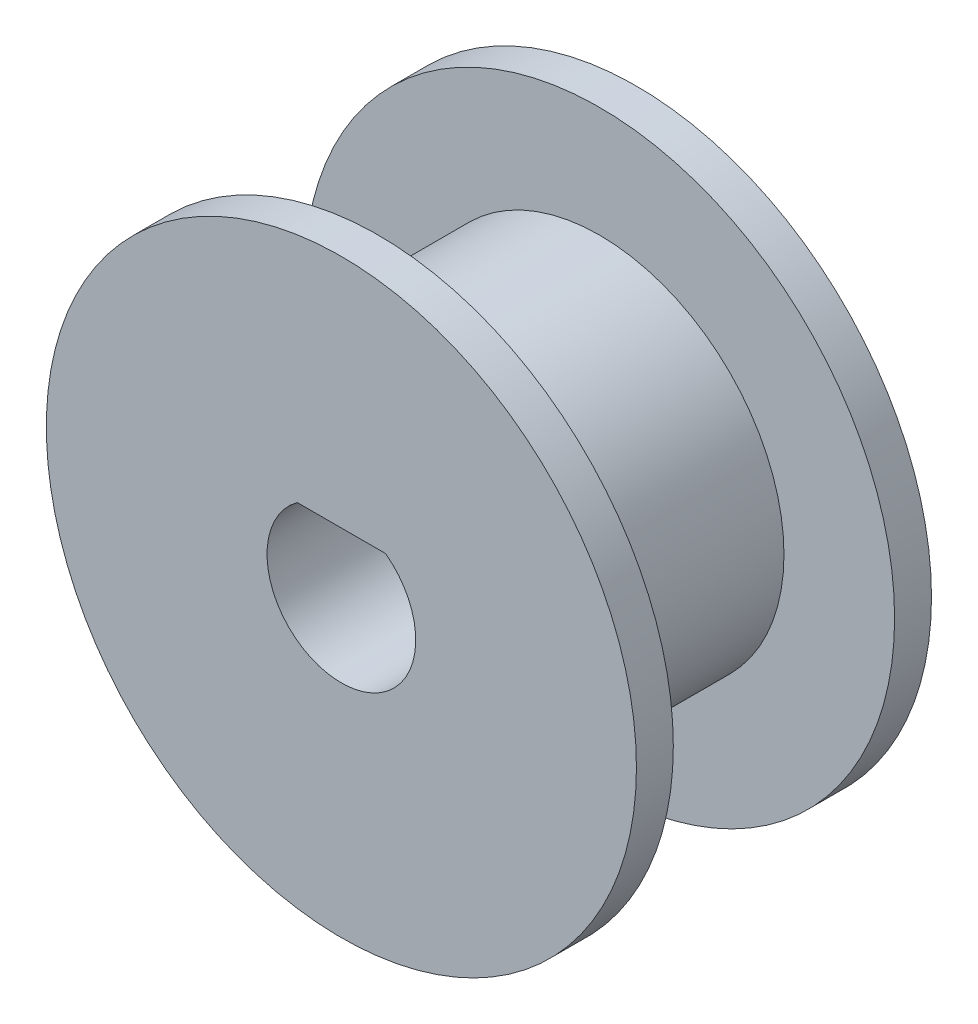
ISO-10303-21;
HEADER;
FILE_DESCRIPTION(('STEP AP214'),'2;1');
FILE_NAME('part.step','',(''),(''),'','','');
FILE_SCHEMA(('AUTOMOTIVE_DESIGN { 1 0 10303 214 1 1 1 1 }'));
ENDSEC;
DATA;
#1=APPLICATION_CONTEXT('core data for automotive mechanical design processes');
#2=APPLICATION_PROTOCOL_DEFINITION('international standard','automotive_design',2000,#1);
#3=PRODUCT_CONTEXT('',#1,'mechanical');
#4=PRODUCT('Part','Part','',(#3));
#5=PRODUCT_RELATED_PRODUCT_CATEGORY('part','',(#4));
#6=PRODUCT_DEFINITION_FORMATION('','',#4);
#7=PRODUCT_DEFINITION_CONTEXT('part definition',#1,'design');
#8=PRODUCT_DEFINITION('design','',#6,#7);
#9=PRODUCT_DEFINITION_SHAPE('','',#8);
#10=(LENGTH_UNIT() NAMED_UNIT(*) SI_UNIT(.MILLI.,.METRE.));
#11=(NAMED_UNIT(*) PLANE_ANGLE_UNIT() SI_UNIT($,.RADIAN.));
#12=(NAMED_UNIT(*) SI_UNIT($,.STERADIAN.) SOLID_ANGLE_UNIT());
#13=UNCERTAINTY_MEASURE_WITH_UNIT(LENGTH_MEASURE(1.E-05),#10,'distance_accuracy_value','');
#14=(GEOMETRIC_REPRESENTATION_CONTEXT(3) GLOBAL_UNCERTAINTY_ASSIGNED_CONTEXT((#13)) GLOBAL_UNIT_ASSIGNED_CONTEXT((#10,
#11,#12)) REPRESENTATION_CONTEXT('',''));
#15=CARTESIAN_POINT('',(0.,0.,0.));
#16=DIRECTION('',(0.,0.,1.));
#17=DIRECTION('',(1.,0.,0.));
#18=AXIS2_PLACEMENT_3D('',#15,#16,#17);
#19=CARTESIAN_POINT('',(0.,0.,6.35));
#20=DIRECTION('',(0.,0.,-1.));
#21=DIRECTION('',(-1.,0.,0.));
#22=AXIS2_PLACEMENT_3D('',#19,#20,#21);
#23=CYLINDRICAL_SURFACE('',#22,12.7);
#24=CARTESIAN_POINT('',(0.,0.,-6.35));
#25=DIRECTION('',(0.,0.,1.));
#26=DIRECTION('',(1.,0.,0.));
#27=AXIS2_PLACEMENT_3D('',#24,#25,#26);
#28=CIRCLE('',#27,12.7);
#29=CARTESIAN_POINT('',(12.7,0.,-6.35));
#30=VERTEX_POINT('',#29);
#31=EDGE_CURVE('E43',#30,#30,#28,.T.);
#32=ORIENTED_EDGE('',*,*,#31,.T.);
#33=EDGE_LOOP('',(#32));
#34=FACE_BOUND('',#33,.T.);
#35=CARTESIAN_POINT('',(0.,0.,-4.7625));
#36=DIRECTION('',(0.,0.,1.));
#37=DIRECTION('',(1.,0.,0.));
#38=AXIS2_PLACEMENT_3D('',#35,#36,#37);
#39=CIRCLE('',#38,12.7);
#40=CARTESIAN_POINT('',(12.7,0.,-4.7625));
#41=VERTEX_POINT('',#40);
#42=EDGE_CURVE('E38',#41,#41,#39,.T.);
#43=ORIENTED_EDGE('',*,*,#42,.F.);
#44=EDGE_LOOP('',(#43));
#45=FACE_BOUND('',#44,.T.);
#46=ADVANCED_FACE('F34',(#34,#45),#23,.T.);
#47=CARTESIAN_POINT('',(0.,0.,-6.35));
#48=DIRECTION('',(0.,0.,1.));
#49=DIRECTION('',(1.,0.,0.));
#50=AXIS2_PLACEMENT_3D('',#47,#48,#49);
#51=PLANE('',#50);
#52=DIRECTION('',(-1.,0.,0.));
#53=VECTOR('',#52,1.);
#54=CARTESIAN_POINT('',(-1.9,2.57487863791675,-6.35));
#55=LINE('',#54,#53);
#56=CARTESIAN_POINT('',(1.9,2.57487863791675,-6.35));
#57=VERTEX_POINT('',#56);
#58=CARTESIAN_POINT('',(-1.9,2.57487863791675,-6.35));
#59=VERTEX_POINT('',#58);
#60=EDGE_CURVE('E80',#57,#59,#55,.T.);
#61=ORIENTED_EDGE('',*,*,#60,.T.);
#62=CARTESIAN_POINT('',(0.,0.,-6.35));
#63=DIRECTION('',(0.,0.,1.));
#64=DIRECTION('',(1.,0.,0.));
#65=AXIS2_PLACEMENT_3D('',#62,#63,#64);
#66=CIRCLE('',#65,3.2);
#67=EDGE_CURVE('E51',#59,#57,#66,.T.);
#68=ORIENTED_EDGE('',*,*,#67,.T.);
#69=EDGE_LOOP('',(#61,#68));
#70=FACE_BOUND('',#69,.T.);
#71=ORIENTED_EDGE('',*,*,#31,.F.);
#72=EDGE_LOOP('',(#71));
#73=FACE_BOUND('',#72,.T.);
#74=ADVANCED_FACE('F99',(#70,#73),#51,.F.);
#75=CARTESIAN_POINT('',(0.,0.,-4.7625));
#76=DIRECTION('',(0.,0.,1.));
#77=DIRECTION('',(1.,0.,0.));
#78=AXIS2_PLACEMENT_3D('',#75,#76,#77);
#79=PLANE('',#78);
#80=CARTESIAN_POINT('',(0.,0.,-4.7625));
#81=DIRECTION('',(0.,0.,1.));
#82=DIRECTION('',(1.,0.,0.));
#83=AXIS2_PLACEMENT_3D('',#80,#81,#82);
#84=CIRCLE('',#83,7.9375);
#85=CARTESIAN_POINT('',(7.9375,0.,-4.7625));
#86=VERTEX_POINT('',#85);
#87=EDGE_CURVE('E83',#86,#86,#84,.T.);
#88=ORIENTED_EDGE('',*,*,#87,.F.);
#89=EDGE_LOOP('',(#88));
#90=FACE_BOUND('',#89,.T.);
#91=ORIENTED_EDGE('',*,*,#42,.T.);
#92=EDGE_LOOP('',(#91));
#93=FACE_BOUND('',#92,.T.);
#94=ADVANCED_FACE('F96',(#90,#93),#79,.T.);
#95=CARTESIAN_POINT('',(0.,0.,4.7625));
#96=DIRECTION('',(0.,0.,1.));
#97=DIRECTION('',(1.,0.,0.));
#98=AXIS2_PLACEMENT_3D('',#95,#96,#97);
#99=PLANE('',#98);
#100=CARTESIAN_POINT('',(0.,0.,4.7625));
#101=DIRECTION('',(0.,0.,1.));
#102=DIRECTION('',(1.,0.,0.));
#103=AXIS2_PLACEMENT_3D('',#100,#101,#102);
#104=CIRCLE('',#103,7.9375);
#105=CARTESIAN_POINT('',(7.9375,0.,4.7625));
#106=VERTEX_POINT('',#105);
#107=EDGE_CURVE('E67',#106,#106,#104,.T.);
#108=ORIENTED_EDGE('',*,*,#107,.T.);
#109=EDGE_LOOP('',(#108));
#110=FACE_BOUND('',#109,.T.);
#111=CARTESIAN_POINT('',(0.,0.,4.7625));
#112=DIRECTION('',(0.,0.,1.));
#113=DIRECTION('',(1.,0.,0.));
#114=AXIS2_PLACEMENT_3D('',#111,#112,#113);
#115=CIRCLE('',#114,12.7);
#116=CARTESIAN_POINT('',(12.7,0.,4.7625));
#117=VERTEX_POINT('',#116);
#118=EDGE_CURVE('E86',#117,#117,#115,.T.);
#119=ORIENTED_EDGE('',*,*,#118,.F.);
#120=EDGE_LOOP('',(#119));
#121=FACE_BOUND('',#120,.T.);
#122=ADVANCED_FACE('F118',(#110,#121),#99,.F.);
#123=CARTESIAN_POINT('',(0.,0.,-4.7625));
#124=DIRECTION('',(0.,0.,1.));
#125=DIRECTION('',(1.,0.,0.));
#126=AXIS2_PLACEMENT_3D('',#123,#124,#125);
#127=CYLINDRICAL_SURFACE('',#126,7.9375);
#128=CARTESIAN_POINT('',(7.9375,0.,-4.7625));
#129=CARTESIAN_POINT('',(7.9375,0.,-4.66328125));
#130=CARTESIAN_POINT('',(7.9375,0.,-4.5640625));
#131=CARTESIAN_POINT('',(7.9375,0.,-4.365625));
#132=CARTESIAN_POINT('',(7.9375,0.,-4.26640625));
#133=CARTESIAN_POINT('',(7.9375,0.,-4.06796875));
#134=CARTESIAN_POINT('',(7.9375,0.,-3.96875));
#135=CARTESIAN_POINT('',(7.9375,0.,-3.7703125));
#136=CARTESIAN_POINT('',(7.9375,0.,-3.67109375));
#137=CARTESIAN_POINT('',(7.9375,0.,-3.47265625));
#138=CARTESIAN_POINT('',(7.9375,0.,-3.3734375));
#139=CARTESIAN_POINT('',(7.9375,0.,-3.175));
#140=CARTESIAN_POINT('',(7.9375,0.,-3.07578125));
#141=CARTESIAN_POINT('',(7.9375,0.,-2.87734375));
#142=CARTESIAN_POINT('',(7.9375,0.,-2.778125));
#143=CARTESIAN_POINT('',(7.9375,0.,-2.5796875));
#144=CARTESIAN_POINT('',(7.9375,0.,-2.48046875));
#145=CARTESIAN_POINT('',(7.9375,0.,-2.28203125));
#146=CARTESIAN_POINT('',(7.9375,0.,-2.1828125));
#147=CARTESIAN_POINT('',(7.9375,0.,-1.984375));
#148=CARTESIAN_POINT('',(7.9375,0.,-1.88515625));
#149=CARTESIAN_POINT('',(7.9375,0.,-1.68671875));
#150=CARTESIAN_POINT('',(7.9375,0.,-1.5875));
#151=CARTESIAN_POINT('',(7.9375,0.,-1.3890625));
#152=CARTESIAN_POINT('',(7.9375,0.,-1.28984375));
#153=CARTESIAN_POINT('',(7.9375,0.,-1.09140625));
#154=CARTESIAN_POINT('',(7.9375,0.,-0.9921875));
#155=CARTESIAN_POINT('',(7.9375,0.,-0.79375));
#156=CARTESIAN_POINT('',(7.9375,0.,-0.69453125));
#157=CARTESIAN_POINT('',(7.9375,0.,-0.49609375));
#158=CARTESIAN_POINT('',(7.9375,0.,-0.396875));
#159=CARTESIAN_POINT('',(7.9375,0.,-0.1984375));
#160=CARTESIAN_POINT('',(7.9375,0.,-0.0992187500000001));
#161=CARTESIAN_POINT('',(7.9375,0.,0.0992187500000001));
#162=CARTESIAN_POINT('',(7.9375,0.,0.1984375));
#163=CARTESIAN_POINT('',(7.9375,0.,0.396875));
#164=CARTESIAN_POINT('',(7.9375,0.,0.49609375));
#165=CARTESIAN_POINT('',(7.9375,0.,0.69453125));
#166=CARTESIAN_POINT('',(7.9375,0.,0.793750000000001));
#167=CARTESIAN_POINT('',(7.9375,0.,0.992187500000001));
#168=CARTESIAN_POINT('',(7.9375,0.,1.09140625));
#169=CARTESIAN_POINT('',(7.9375,0.,1.28984375));
#170=CARTESIAN_POINT('',(7.9375,0.,1.3890625));
#171=CARTESIAN_POINT('',(7.9375,0.,1.5875));
#172=CARTESIAN_POINT('',(7.9375,0.,1.68671875));
#173=CARTESIAN_POINT('',(7.9375,0.,1.88515625));
#174=CARTESIAN_POINT('',(7.9375,0.,1.984375));
#175=CARTESIAN_POINT('',(7.9375,0.,2.1828125));
#176=CARTESIAN_POINT('',(7.9375,0.,2.28203125));
#177=CARTESIAN_POINT('',(7.9375,0.,2.48046875));
#178=CARTESIAN_POINT('',(7.9375,0.,2.5796875));
#179=CARTESIAN_POINT('',(7.9375,0.,2.778125));
#180=CARTESIAN_POINT('',(7.9375,0.,2.87734375));
#181=CARTESIAN_POINT('',(7.9375,0.,3.07578125));
#182=CARTESIAN_POINT('',(7.9375,0.,3.175));
#183=CARTESIAN_POINT('',(7.9375,0.,3.3734375));
#184=CARTESIAN_POINT('',(7.9375,0.,3.47265625));
#185=CARTESIAN_POINT('',(7.9375,0.,3.67109375));
#186=CARTESIAN_POINT('',(7.9375,0.,3.7703125));
#187=CARTESIAN_POINT('',(7.9375,0.,3.96875));
#188=CARTESIAN_POINT('',(7.9375,0.,4.06796875));
#189=CARTESIAN_POINT('',(7.9375,0.,4.26640625));
#190=CARTESIAN_POINT('',(7.9375,0.,4.365625));
#191=CARTESIAN_POINT('',(7.9375,0.,4.5640625));
#192=CARTESIAN_POINT('',(7.9375,0.,4.66328125));
#193=CARTESIAN_POINT('',(7.9375,0.,4.7625));
#194=B_SPLINE_CURVE_WITH_KNOTS('',3,(#128,#129,#130,#131,#132,#133,#134,#135,#136,#137,#138,
#139,#140,#141,#142,#143,#144,#145,#146,#147,#148,#149,#150,#151,#152,#153,#154,#155,#156,#157,
#158,#159,#160,#161,#162,#163,#164,#165,#166,#167,#168,#169,#170,#171,#172,#173,#174,#175,#176,
#177,#178,#179,#180,#181,#182,#183,#184,#185,#186,#187,#188,#189,#190,#191,#192,#193),
.UNSPECIFIED.,.F.,.F.,(4,2,2,2,2,2,2,2,2,2,2,2,2,2,2,2,2,2,2,2,2,2,2,2,2,2,2,2,2,2,2,2,4),(0.,
0.297656249999999,0.595312499999999,0.89296875,1.190625,1.48828125,1.7859375,2.08359375,2.38125,
2.67890625,2.9765625,3.27421875,3.571875,3.86953125,4.1671875,4.46484375,4.7625,5.06015625,
5.3578125,5.65546875,5.953125,6.25078125,6.5484375,6.84609375,7.14375,7.44140625,7.7390625,
8.03671875,8.334375,8.63203125,8.9296875,9.22734375,9.525),.UNSPECIFIED.);
#195=EDGE_CURVE('BSEAM111',#86,#106,#194,.T.);
#196=ORIENTED_EDGE('',*,*,#87,.T.);
#197=ORIENTED_EDGE('',*,*,#107,.F.);
#198=ORIENTED_EDGE('',*,*,#195,.T.);
#199=ORIENTED_EDGE('',*,*,#195,.F.);
#200=EDGE_LOOP('',(#196,#198,#197,#199));
#201=FACE_BOUND('',#200,.T.);
#202=ADVANCED_FACE('F111',(#201),#127,.T.);
#203=CARTESIAN_POINT('',(0.,0.,6.35));
#204=DIRECTION('',(0.,0.,1.));
#205=DIRECTION('',(1.,0.,0.));
#206=AXIS2_PLACEMENT_3D('',#203,#204,#205);
#207=PLANE('',#206);
#208=CARTESIAN_POINT('',(0.,0.,6.35));
#209=DIRECTION('',(0.,0.,1.));
#210=DIRECTION('',(1.,0.,0.));
#211=AXIS2_PLACEMENT_3D('',#208,#209,#210);
#212=CIRCLE('',#211,3.2);
#213=CARTESIAN_POINT('',(-1.9,2.57487863791675,6.35));
#214=VERTEX_POINT('',#213);
#215=CARTESIAN_POINT('',(1.9,2.57487863791675,6.35));
#216=VERTEX_POINT('',#215);
#217=EDGE_CURVE('E56',#214,#216,#212,.T.);
#218=ORIENTED_EDGE('',*,*,#217,.F.);
#219=DIRECTION('',(-1.,0.,0.));
#220=VECTOR('',#219,1.);
#221=CARTESIAN_POINT('',(-1.9,2.57487863791675,6.35));
#222=LINE('',#221,#220);
#223=EDGE_CURVE('E71',#216,#214,#222,.T.);
#224=ORIENTED_EDGE('',*,*,#223,.F.);
#225=EDGE_LOOP('',(#218,#224));
#226=FACE_BOUND('',#225,.T.);
#227=CARTESIAN_POINT('',(0.,0.,6.35));
#228=DIRECTION('',(0.,0.,1.));
#229=DIRECTION('',(1.,0.,0.));
#230=AXIS2_PLACEMENT_3D('',#227,#228,#229);
#231=CIRCLE('',#230,12.7);
#232=CARTESIAN_POINT('',(12.7,0.,6.35));
#233=VERTEX_POINT('',#232);
#234=EDGE_CURVE('E12',#233,#233,#231,.T.);
#235=ORIENTED_EDGE('',*,*,#234,.T.);
#236=EDGE_LOOP('',(#235));
#237=FACE_BOUND('',#236,.T.);
#238=ADVANCED_FACE('F75',(#226,#237),#207,.T.);
#239=ORIENTED_EDGE('',*,*,#118,.T.);
#240=EDGE_LOOP('',(#239));
#241=FACE_BOUND('',#240,.T.);
#242=ORIENTED_EDGE('',*,*,#234,.F.);
#243=EDGE_LOOP('',(#242));
#244=FACE_BOUND('',#243,.T.);
#245=ADVANCED_FACE('F36',(#241,#244),#23,.T.);
#246=CARTESIAN_POINT('',(0.,0.,-6.35));
#247=DIRECTION('',(0.,0.,1.));
#248=DIRECTION('',(1.,0.,0.));
#249=AXIS2_PLACEMENT_3D('',#246,#247,#248);
#250=CYLINDRICAL_SURFACE('',#249,3.2);
#251=DIRECTION('',(0.,0.,1.));
#252=VECTOR('',#251,1.);
#253=CARTESIAN_POINT('',(1.9,2.57487863791675,-6.35));
#254=LINE('',#253,#252);
#255=EDGE_CURVE('E68',#57,#216,#254,.T.);
#256=ORIENTED_EDGE('',*,*,#255,.F.);
#257=ORIENTED_EDGE('',*,*,#67,.F.);
#258=DIRECTION('',(0.,0.,1.));
#259=VECTOR('',#258,1.);
#260=CARTESIAN_POINT('',(-1.9,2.57487863791675,-6.35));
#261=LINE('',#260,#259);
#262=EDGE_CURVE('E61',#59,#214,#261,.T.);
#263=ORIENTED_EDGE('',*,*,#262,.T.);
#264=ORIENTED_EDGE('',*,*,#217,.T.);
#265=EDGE_LOOP('',(#256,#257,#263,#264));
#266=FACE_BOUND('',#265,.T.);
#267=ADVANCED_FACE('F63',(#266),#250,.F.);
#268=CARTESIAN_POINT('',(-1.9,2.57487863791675,-6.35));
#269=DIRECTION('',(0.,1.,0.));
#270=DIRECTION('',(0.,0.,1.));
#271=AXIS2_PLACEMENT_3D('',#268,#269,#270);
#272=PLANE('',#271);
#273=ORIENTED_EDGE('',*,*,#262,.F.);
#274=ORIENTED_EDGE('',*,*,#60,.F.);
#275=ORIENTED_EDGE('',*,*,#255,.T.);
#276=ORIENTED_EDGE('',*,*,#223,.T.);
#277=EDGE_LOOP('',(#273,#274,#275,#276));
#278=FACE_BOUND('',#277,.T.);
#279=ADVANCED_FACE('F72',(#278),#272,.F.);
#280=CLOSED_SHELL('',(#46,#74,#94,#122,#202,#238,#245,#267,#279));
#281=MANIFOLD_SOLID_BREP('B2',#280);
#282=ADVANCED_BREP_SHAPE_REPRESENTATION('',(#18,#281),#14);
#283=SHAPE_DEFINITION_REPRESENTATION(#9,#282);
ENDSEC;
END-ISO-10303-21;
